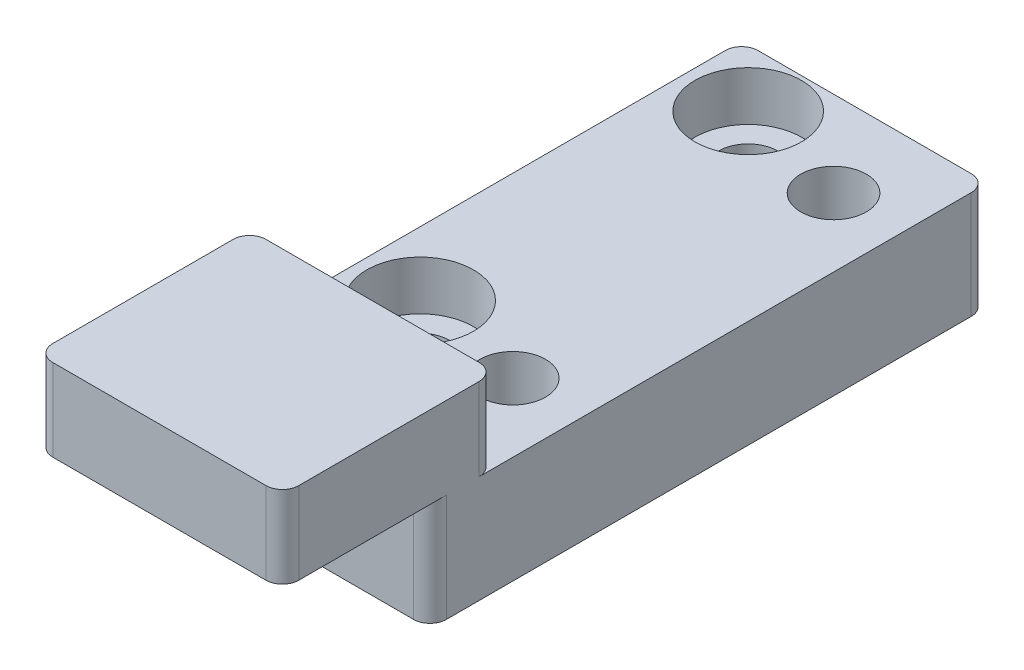
ISO-10303-21;
HEADER;
FILE_DESCRIPTION(('STEP AP214'),'2;1');
FILE_NAME('part.step','',(''),(''),'','','');
FILE_SCHEMA(('AUTOMOTIVE_DESIGN { 1 0 10303 214 1 1 1 1 }'));
ENDSEC;
DATA;
#1=APPLICATION_CONTEXT('core data for automotive mechanical design processes');
#2=APPLICATION_PROTOCOL_DEFINITION('international standard','automotive_design',2000,#1);
#3=PRODUCT_CONTEXT('',#1,'mechanical');
#4=PRODUCT('Part','Part','',(#3));
#5=PRODUCT_RELATED_PRODUCT_CATEGORY('part','',(#4));
#6=PRODUCT_DEFINITION_FORMATION('','',#4);
#7=PRODUCT_DEFINITION_CONTEXT('part definition',#1,'design');
#8=PRODUCT_DEFINITION('design','',#6,#7);
#9=PRODUCT_DEFINITION_SHAPE('','',#8);
#10=(LENGTH_UNIT() NAMED_UNIT(*) SI_UNIT(.MILLI.,.METRE.));
#11=(NAMED_UNIT(*) PLANE_ANGLE_UNIT() SI_UNIT($,.RADIAN.));
#12=(NAMED_UNIT(*) SI_UNIT($,.STERADIAN.) SOLID_ANGLE_UNIT());
#13=UNCERTAINTY_MEASURE_WITH_UNIT(LENGTH_MEASURE(1.E-05),#10,'distance_accuracy_value','');
#14=(GEOMETRIC_REPRESENTATION_CONTEXT(3) GLOBAL_UNCERTAINTY_ASSIGNED_CONTEXT((#13)) GLOBAL_UNIT_ASSIGNED_CONTEXT((#10,
#11,#12)) REPRESENTATION_CONTEXT('',''));
#15=CARTESIAN_POINT('',(0.,0.,0.));
#16=DIRECTION('',(0.,0.,1.));
#17=DIRECTION('',(1.,0.,0.));
#18=AXIS2_PLACEMENT_3D('',#15,#16,#17);
#19=CARTESIAN_POINT('',(0.,0.,30.));
#20=DIRECTION('',(0.,1.,0.));
#21=DIRECTION('',(0.,0.,1.));
#22=AXIS2_PLACEMENT_3D('',#19,#20,#21);
#23=PLANE('',#22);
#24=CARTESIAN_POINT('',(3.89999999997732,0.,3.49999999997199));
#25=DIRECTION('',(0.,1.,0.));
#26=DIRECTION('',(0.,0.,1.));
#27=AXIS2_PLACEMENT_3D('',#24,#25,#26);
#28=CIRCLE('',#27,1.8);
#29=CARTESIAN_POINT('',(3.89999999997732,0.,5.29999999997199));
#30=VERTEX_POINT('',#29);
#31=EDGE_CURVE('E276',#30,#30,#28,.T.);
#32=ORIENTED_EDGE('',*,*,#31,.T.);
#33=EDGE_LOOP('',(#32));
#34=FACE_BOUND('',#33,.T.);
#35=CARTESIAN_POINT('',(3.89999999997738,0.,23.499999999972));
#36=DIRECTION('',(0.,1.,0.));
#37=DIRECTION('',(0.,0.,1.));
#38=AXIS2_PLACEMENT_3D('',#35,#36,#37);
#39=CIRCLE('',#38,1.8);
#40=CARTESIAN_POINT('',(3.89999999997738,0.,25.299999999972));
#41=VERTEX_POINT('',#40);
#42=EDGE_CURVE('E260',#41,#41,#39,.T.);
#43=ORIENTED_EDGE('',*,*,#42,.T.);
#44=EDGE_LOOP('',(#43));
#45=FACE_BOUND('',#44,.T.);
#46=DIRECTION('',(1.,0.,0.));
#47=VECTOR('',#46,1.);
#48=CARTESIAN_POINT('',(0.,0.,0.));
#49=LINE('',#48,#47);
#50=CARTESIAN_POINT('',(1.,0.,0.));
#51=VERTEX_POINT('',#50);
#52=CARTESIAN_POINT('',(14.,0.,0.));
#53=VERTEX_POINT('',#52);
#54=EDGE_CURVE('E256',#51,#53,#49,.T.);
#55=ORIENTED_EDGE('',*,*,#54,.T.);
#56=CARTESIAN_POINT('',(14.,0.,1.));
#57=DIRECTION('',(0.,1.,0.));
#58=DIRECTION('',(0.,0.,1.));
#59=AXIS2_PLACEMENT_3D('',#56,#57,#58);
#60=CIRCLE('',#59,1.);
#61=CARTESIAN_POINT('',(15.,0.,1.));
#62=VERTEX_POINT('',#61);
#63=EDGE_CURVE('E201',#53,#62,#60,.F.);
#64=ORIENTED_EDGE('',*,*,#63,.T.);
#65=DIRECTION('',(0.,0.,-1.));
#66=VECTOR('',#65,1.);
#67=CARTESIAN_POINT('',(15.,0.,30.));
#68=LINE('',#67,#66);
#69=CARTESIAN_POINT('',(15.,0.,33.));
#70=VERTEX_POINT('',#69);
#71=EDGE_CURVE('E167',#70,#62,#68,.T.);
#72=ORIENTED_EDGE('',*,*,#71,.F.);
#73=CARTESIAN_POINT('',(14.,0.,33.));
#74=DIRECTION('',(0.,1.,0.));
#75=DIRECTION('',(0.,0.,1.));
#76=AXIS2_PLACEMENT_3D('',#73,#74,#75);
#77=CIRCLE('',#76,1.);
#78=CARTESIAN_POINT('',(14.,0.,34.));
#79=VERTEX_POINT('',#78);
#80=EDGE_CURVE('E197',#70,#79,#77,.F.);
#81=ORIENTED_EDGE('',*,*,#80,.T.);
#82=DIRECTION('',(1.,0.,0.));
#83=VECTOR('',#82,1.);
#84=CARTESIAN_POINT('',(-17.4023492954256,0.,34.));
#85=LINE('',#84,#83);
#86=CARTESIAN_POINT('',(1.,0.,34.));
#87=VERTEX_POINT('',#86);
#88=EDGE_CURVE('E325',#87,#79,#85,.T.);
#89=ORIENTED_EDGE('',*,*,#88,.F.);
#90=CARTESIAN_POINT('',(1.,0.,33.));
#91=DIRECTION('',(0.,1.,0.));
#92=DIRECTION('',(0.,0.,1.));
#93=AXIS2_PLACEMENT_3D('',#90,#91,#92);
#94=CIRCLE('',#93,1.);
#95=CARTESIAN_POINT('',(0.,0.,33.));
#96=VERTEX_POINT('',#95);
#97=EDGE_CURVE('E195',#87,#96,#94,.F.);
#98=ORIENTED_EDGE('',*,*,#97,.T.);
#99=DIRECTION('',(0.,0.,-1.));
#100=VECTOR('',#99,1.);
#101=CARTESIAN_POINT('',(0.,0.,30.));
#102=LINE('',#101,#100);
#103=CARTESIAN_POINT('',(0.,0.,1.));
#104=VERTEX_POINT('',#103);
#105=EDGE_CURVE('E177',#96,#104,#102,.T.);
#106=ORIENTED_EDGE('',*,*,#105,.T.);
#107=CARTESIAN_POINT('',(1.,0.,1.));
#108=DIRECTION('',(0.,1.,0.));
#109=DIRECTION('',(0.,0.,1.));
#110=AXIS2_PLACEMENT_3D('',#107,#108,#109);
#111=CIRCLE('',#110,1.);
#112=EDGE_CURVE('E199',#104,#51,#111,.F.);
#113=ORIENTED_EDGE('',*,*,#112,.T.);
#114=EDGE_LOOP('',(#55,#64,#72,#81,#89,#98,#106,#113));
#115=FACE_BOUND('',#114,.T.);
#116=CARTESIAN_POINT('',(10.8249999999983,0.,5.22100000000256));
#117=DIRECTION('',(0.,-1.,0.));
#118=DIRECTION('',(0.,0.,-1.));
#119=AXIS2_PLACEMENT_3D('',#116,#117,#118);
#120=CIRCLE('',#119,3.57251);
#121=CARTESIAN_POINT('',(10.8249999999983,0.,1.64849000000256));
#122=VERTEX_POINT('',#121);
#123=EDGE_CURVE('E297',#122,#122,#120,.T.);
#124=ORIENTED_EDGE('',*,*,#123,.F.);
#125=EDGE_LOOP('',(#124));
#126=FACE_BOUND('',#125,.T.);
#127=CARTESIAN_POINT('',(10.8249999999982,0.,24.7790000000026));
#128=DIRECTION('',(0.,-1.,0.));
#129=DIRECTION('',(0.,0.,-1.));
#130=AXIS2_PLACEMENT_3D('',#127,#128,#129);
#131=CIRCLE('',#130,3.57251);
#132=CARTESIAN_POINT('',(10.8249999999982,0.,21.2064900000026));
#133=VERTEX_POINT('',#132);
#134=EDGE_CURVE('E309',#133,#133,#131,.T.);
#135=ORIENTED_EDGE('',*,*,#134,.F.);
#136=EDGE_LOOP('',(#135));
#137=FACE_BOUND('',#136,.T.);
#138=ADVANCED_FACE('F33',(#34,#45,#115,#126,#137),#23,.F.);
#139=CARTESIAN_POINT('',(0.,0.,30.));
#140=DIRECTION('',(1.,0.,0.));
#141=DIRECTION('',(0.,0.,-1.));
#142=AXIS2_PLACEMENT_3D('',#139,#140,#141);
#143=PLANE('',#142);
#144=DIRECTION('',(0.,0.,-1.));
#145=VECTOR('',#144,1.);
#146=CARTESIAN_POINT('',(0.,6.539,30.));
#147=LINE('',#146,#145);
#148=CARTESIAN_POINT('',(0.,6.539,31.));
#149=VERTEX_POINT('',#148);
#150=CARTESIAN_POINT('',(0.,6.539,1.));
#151=VERTEX_POINT('',#150);
#152=EDGE_CURVE('E175',#149,#151,#147,.T.);
#153=ORIENTED_EDGE('',*,*,#152,.T.);
#154=DIRECTION('',(0.,-1.,0.));
#155=VECTOR('',#154,1.);
#156=CARTESIAN_POINT('',(0.,0.,1.));
#157=LINE('',#156,#155);
#158=EDGE_CURVE('E212',#151,#104,#157,.T.);
#159=ORIENTED_EDGE('',*,*,#158,.T.);
#160=ORIENTED_EDGE('',*,*,#105,.F.);
#161=DIRECTION('',(0.,1.,0.));
#162=VECTOR('',#161,1.);
#163=CARTESIAN_POINT('',(0.,6.569,33.));
#164=LINE('',#163,#162);
#165=CARTESIAN_POINT('',(0.,6.569,33.));
#166=VERTEX_POINT('',#165);
#167=EDGE_CURVE('E206',#96,#166,#164,.T.);
#168=ORIENTED_EDGE('',*,*,#167,.T.);
#169=DIRECTION('',(0.,0.,1.));
#170=VECTOR('',#169,1.);
#171=CARTESIAN_POINT('',(0.,6.569,34.));
#172=LINE('',#171,#170);
#173=CARTESIAN_POINT('',(0.,6.569,42.));
#174=VERTEX_POINT('',#173);
#175=EDGE_CURVE('E315',#166,#174,#172,.T.);
#176=ORIENTED_EDGE('',*,*,#175,.T.);
#177=DIRECTION('',(0.,1.,0.));
#178=VECTOR('',#177,1.);
#179=CARTESIAN_POINT('',(0.,11.569,42.));
#180=LINE('',#179,#178);
#181=CARTESIAN_POINT('',(0.,11.569,42.));
#182=VERTEX_POINT('',#181);
#183=EDGE_CURVE('E203',#174,#182,#180,.T.);
#184=ORIENTED_EDGE('',*,*,#183,.T.);
#185=DIRECTION('',(0.,0.,-1.));
#186=VECTOR('',#185,1.);
#187=CARTESIAN_POINT('',(0.,11.569,43.));
#188=LINE('',#187,#186);
#189=CARTESIAN_POINT('',(0.,11.569,31.));
#190=VERTEX_POINT('',#189);
#191=EDGE_CURVE('E312',#182,#190,#188,.T.);
#192=ORIENTED_EDGE('',*,*,#191,.T.);
#193=DIRECTION('',(0.,-1.,0.));
#194=VECTOR('',#193,1.);
#195=CARTESIAN_POINT('',(0.,6.539,31.));
#196=LINE('',#195,#194);
#197=EDGE_CURVE('E209',#190,#149,#196,.T.);
#198=ORIENTED_EDGE('',*,*,#197,.T.);
#199=EDGE_LOOP('',(#153,#159,#160,#168,#176,#184,#192,#198));
#200=FACE_BOUND('',#199,.T.);
#201=ADVANCED_FACE('F334',(#200),#143,.F.);
#202=CARTESIAN_POINT('',(15.,0.,30.));
#203=DIRECTION('',(-1.,0.,0.));
#204=DIRECTION('',(0.,0.,1.));
#205=AXIS2_PLACEMENT_3D('',#202,#203,#204);
#206=PLANE('',#205);
#207=ORIENTED_EDGE('',*,*,#71,.T.);
#208=DIRECTION('',(0.,1.,0.));
#209=VECTOR('',#208,1.);
#210=CARTESIAN_POINT('',(15.,6.539,1.));
#211=LINE('',#210,#209);
#212=CARTESIAN_POINT('',(15.,6.539,1.));
#213=VERTEX_POINT('',#212);
#214=EDGE_CURVE('E150',#62,#213,#211,.T.);
#215=ORIENTED_EDGE('',*,*,#214,.T.);
#216=DIRECTION('',(0.,0.,-1.));
#217=VECTOR('',#216,1.);
#218=CARTESIAN_POINT('',(15.,6.539,30.));
#219=LINE('',#218,#217);
#220=CARTESIAN_POINT('',(15.,6.539,31.));
#221=VERTEX_POINT('',#220);
#222=EDGE_CURVE('E163',#221,#213,#219,.T.);
#223=ORIENTED_EDGE('',*,*,#222,.F.);
#224=DIRECTION('',(0.,1.,0.));
#225=VECTOR('',#224,1.);
#226=CARTESIAN_POINT('',(15.,11.569,31.));
#227=LINE('',#226,#225);
#228=CARTESIAN_POINT('',(15.,11.569,31.));
#229=VERTEX_POINT('',#228);
#230=EDGE_CURVE('E168',#221,#229,#227,.T.);
#231=ORIENTED_EDGE('',*,*,#230,.T.);
#232=DIRECTION('',(0.,0.,1.));
#233=VECTOR('',#232,1.);
#234=CARTESIAN_POINT('',(15.,11.569,43.));
#235=LINE('',#234,#233);
#236=CARTESIAN_POINT('',(15.,11.569,42.));
#237=VERTEX_POINT('',#236);
#238=EDGE_CURVE('E328',#229,#237,#235,.T.);
#239=ORIENTED_EDGE('',*,*,#238,.T.);
#240=DIRECTION('',(0.,-1.,0.));
#241=VECTOR('',#240,1.);
#242=CARTESIAN_POINT('',(15.,6.569,42.));
#243=LINE('',#242,#241);
#244=CARTESIAN_POINT('',(15.,6.569,42.));
#245=VERTEX_POINT('',#244);
#246=EDGE_CURVE('E186',#237,#245,#243,.T.);
#247=ORIENTED_EDGE('',*,*,#246,.T.);
#248=DIRECTION('',(0.,0.,-1.));
#249=VECTOR('',#248,1.);
#250=CARTESIAN_POINT('',(15.,6.569,34.));
#251=LINE('',#250,#249);
#252=CARTESIAN_POINT('',(15.,6.569,33.));
#253=VERTEX_POINT('',#252);
#254=EDGE_CURVE('E244',#245,#253,#251,.T.);
#255=ORIENTED_EDGE('',*,*,#254,.T.);
#256=DIRECTION('',(0.,-1.,0.));
#257=VECTOR('',#256,1.);
#258=CARTESIAN_POINT('',(15.,0.,33.));
#259=LINE('',#258,#257);
#260=EDGE_CURVE('E189',#253,#70,#259,.T.);
#261=ORIENTED_EDGE('',*,*,#260,.T.);
#262=EDGE_LOOP('',(#207,#215,#223,#231,#239,#247,#255,#261));
#263=FACE_BOUND('',#262,.T.);
#264=ADVANCED_FACE('F161',(#263),#206,.F.);
#265=CARTESIAN_POINT('',(0.,6.539,30.));
#266=DIRECTION('',(0.,-1.,0.));
#267=DIRECTION('',(0.,0.,-1.));
#268=AXIS2_PLACEMENT_3D('',#265,#266,#267);
#269=PLANE('',#268);
#270=CARTESIAN_POINT('',(10.8249999999982,6.539,24.7790000000026));
#271=DIRECTION('',(0.,-1.,0.));
#272=DIRECTION('',(0.,0.,-1.));
#273=AXIS2_PLACEMENT_3D('',#270,#271,#272);
#274=CIRCLE('',#273,1.998650054);
#275=CARTESIAN_POINT('',(10.8249999999982,6.539,22.7803499460026));
#276=VERTEX_POINT('',#275);
#277=EDGE_CURVE('E300',#276,#276,#274,.T.);
#278=ORIENTED_EDGE('',*,*,#277,.T.);
#279=EDGE_LOOP('',(#278));
#280=FACE_BOUND('',#279,.T.);
#281=CARTESIAN_POINT('',(10.8249999999983,6.539,5.22100000000256));
#282=DIRECTION('',(0.,-1.,0.));
#283=DIRECTION('',(0.,0.,-1.));
#284=AXIS2_PLACEMENT_3D('',#281,#282,#283);
#285=CIRCLE('',#284,1.998650054);
#286=CARTESIAN_POINT('',(10.8249999999983,6.539,3.22234994600256));
#287=VERTEX_POINT('',#286);
#288=EDGE_CURVE('E288',#287,#287,#285,.T.);
#289=ORIENTED_EDGE('',*,*,#288,.T.);
#290=EDGE_LOOP('',(#289));
#291=FACE_BOUND('',#290,.T.);
#292=CARTESIAN_POINT('',(3.89999999997732,6.539,3.49999999997199));
#293=DIRECTION('',(0.,1.,0.));
#294=DIRECTION('',(0.,0.,1.));
#295=AXIS2_PLACEMENT_3D('',#292,#293,#294);
#296=CIRCLE('',#295,3.25);
#297=CARTESIAN_POINT('',(3.89999999997732,6.539,6.74999999997199));
#298=VERTEX_POINT('',#297);
#299=EDGE_CURVE('E285',#298,#298,#296,.T.);
#300=ORIENTED_EDGE('',*,*,#299,.F.);
#301=EDGE_LOOP('',(#300));
#302=FACE_BOUND('',#301,.T.);
#303=CARTESIAN_POINT('',(3.89999999997738,6.539,23.499999999972));
#304=DIRECTION('',(0.,1.,0.));
#305=DIRECTION('',(0.,0.,1.));
#306=AXIS2_PLACEMENT_3D('',#303,#304,#305);
#307=CIRCLE('',#306,3.25);
#308=CARTESIAN_POINT('',(3.89999999997738,6.539,26.749999999972));
#309=VERTEX_POINT('',#308);
#310=EDGE_CURVE('E273',#309,#309,#307,.T.);
#311=ORIENTED_EDGE('',*,*,#310,.F.);
#312=EDGE_LOOP('',(#311));
#313=FACE_BOUND('',#312,.T.);
#314=ORIENTED_EDGE('',*,*,#222,.T.);
#315=CARTESIAN_POINT('',(14.,6.539,1.));
#316=DIRECTION('',(0.,-1.,0.));
#317=DIRECTION('',(0.,0.,-1.));
#318=AXIS2_PLACEMENT_3D('',#315,#316,#317);
#319=CIRCLE('',#318,1.);
#320=CARTESIAN_POINT('',(14.,6.539,0.));
#321=VERTEX_POINT('',#320);
#322=EDGE_CURVE('E146',#213,#321,#319,.F.);
#323=ORIENTED_EDGE('',*,*,#322,.T.);
#324=DIRECTION('',(-1.,0.,0.));
#325=VECTOR('',#324,1.);
#326=CARTESIAN_POINT('',(0.,6.539,0.));
#327=LINE('',#326,#325);
#328=CARTESIAN_POINT('',(1.,6.539,0.));
#329=VERTEX_POINT('',#328);
#330=EDGE_CURVE('E259',#321,#329,#327,.T.);
#331=ORIENTED_EDGE('',*,*,#330,.T.);
#332=CARTESIAN_POINT('',(1.,6.539,1.));
#333=DIRECTION('',(0.,-1.,0.));
#334=DIRECTION('',(0.,0.,-1.));
#335=AXIS2_PLACEMENT_3D('',#332,#333,#334);
#336=CIRCLE('',#335,1.);
#337=EDGE_CURVE('E157',#329,#151,#336,.F.);
#338=ORIENTED_EDGE('',*,*,#337,.T.);
#339=ORIENTED_EDGE('',*,*,#152,.F.);
#340=CARTESIAN_POINT('',(1.,6.539,31.));
#341=DIRECTION('',(0.,-1.,0.));
#342=DIRECTION('',(0.,0.,-1.));
#343=AXIS2_PLACEMENT_3D('',#340,#341,#342);
#344=CIRCLE('',#343,1.);
#345=CARTESIAN_POINT('',(1.,6.539,30.));
#346=VERTEX_POINT('',#345);
#347=EDGE_CURVE('E237',#149,#346,#344,.T.);
#348=ORIENTED_EDGE('',*,*,#347,.T.);
#349=DIRECTION('',(-1.,0.,0.));
#350=VECTOR('',#349,1.);
#351=CARTESIAN_POINT('',(0.,6.539,30.));
#352=LINE('',#351,#350);
#353=CARTESIAN_POINT('',(14.,6.539,30.));
#354=VERTEX_POINT('',#353);
#355=EDGE_CURVE('E180',#354,#346,#352,.T.);
#356=ORIENTED_EDGE('',*,*,#355,.F.);
#357=CARTESIAN_POINT('',(14.,6.539,31.));
#358=DIRECTION('',(0.,-1.,0.));
#359=DIRECTION('',(0.,0.,-1.));
#360=AXIS2_PLACEMENT_3D('',#357,#358,#359);
#361=CIRCLE('',#360,1.);
#362=EDGE_CURVE('E173',#354,#221,#361,.T.);
#363=ORIENTED_EDGE('',*,*,#362,.T.);
#364=EDGE_LOOP('',(#314,#323,#331,#338,#339,#348,#356,#363));
#365=FACE_BOUND('',#364,.T.);
#366=ADVANCED_FACE('F170',(#280,#291,#302,#313,#365),#269,.F.);
#367=CARTESIAN_POINT('',(0.,0.,0.));
#368=DIRECTION('',(0.,0.,-1.));
#369=DIRECTION('',(-1.,0.,0.));
#370=AXIS2_PLACEMENT_3D('',#367,#368,#369);
#371=PLANE('',#370);
#372=ORIENTED_EDGE('',*,*,#330,.F.);
#373=DIRECTION('',(0.,1.,0.));
#374=VECTOR('',#373,1.);
#375=CARTESIAN_POINT('',(14.,0.,0.));
#376=LINE('',#375,#374);
#377=EDGE_CURVE('E151',#321,#53,#376,.F.);
#378=ORIENTED_EDGE('',*,*,#377,.T.);
#379=ORIENTED_EDGE('',*,*,#54,.F.);
#380=DIRECTION('',(0.,-1.,0.));
#381=VECTOR('',#380,1.);
#382=CARTESIAN_POINT('',(1.,6.539,0.));
#383=LINE('',#382,#381);
#384=EDGE_CURVE('E156',#51,#329,#383,.F.);
#385=ORIENTED_EDGE('',*,*,#384,.T.);
#386=EDGE_LOOP('',(#372,#378,#379,#385));
#387=FACE_BOUND('',#386,.T.);
#388=ADVANCED_FACE('F366',(#387),#371,.T.);
#389=CARTESIAN_POINT('',(3.89999999997738,6.539,23.499999999972));
#390=DIRECTION('',(0.,1.,0.));
#391=DIRECTION('',(0.,0.,1.));
#392=AXIS2_PLACEMENT_3D('',#389,#390,#391);
#393=CYLINDRICAL_SURFACE('',#392,1.8);
#394=ORIENTED_EDGE('',*,*,#42,.F.);
#395=EDGE_LOOP('',(#394));
#396=FACE_BOUND('',#395,.T.);
#397=CARTESIAN_POINT('',(3.89999999997738,3.539,23.499999999972));
#398=DIRECTION('',(0.,1.,0.));
#399=DIRECTION('',(0.,0.,1.));
#400=AXIS2_PLACEMENT_3D('',#397,#398,#399);
#401=CIRCLE('',#400,1.8);
#402=CARTESIAN_POINT('',(3.89999999997738,3.539,25.299999999972));
#403=VERTEX_POINT('',#402);
#404=EDGE_CURVE('E263',#403,#403,#401,.T.);
#405=ORIENTED_EDGE('',*,*,#404,.T.);
#406=EDGE_LOOP('',(#405));
#407=FACE_BOUND('',#406,.T.);
#408=ADVANCED_FACE('F368',(#396,#407),#393,.F.);
#409=CARTESIAN_POINT('',(5.69999999997738,3.539,23.499999999972));
#410=DIRECTION('',(0.,-1.,0.));
#411=DIRECTION('',(0.,0.,-1.));
#412=AXIS2_PLACEMENT_3D('',#409,#410,#411);
#413=PLANE('',#412);
#414=ORIENTED_EDGE('',*,*,#404,.F.);
#415=EDGE_LOOP('',(#414));
#416=FACE_BOUND('',#415,.T.);
#417=CARTESIAN_POINT('',(3.89999999997738,3.539,23.499999999972));
#418=DIRECTION('',(0.,1.,0.));
#419=DIRECTION('',(0.,0.,1.));
#420=AXIS2_PLACEMENT_3D('',#417,#418,#419);
#421=CIRCLE('',#420,3.25);
#422=CARTESIAN_POINT('',(3.89999999997738,3.539,26.749999999972));
#423=VERTEX_POINT('',#422);
#424=EDGE_CURVE('E270',#423,#423,#421,.T.);
#425=ORIENTED_EDGE('',*,*,#424,.T.);
#426=EDGE_LOOP('',(#425));
#427=FACE_BOUND('',#426,.T.);
#428=ADVANCED_FACE('F374',(#416,#427),#413,.F.);
#429=CARTESIAN_POINT('',(3.89999999997738,6.539,23.499999999972));
#430=DIRECTION('',(0.,1.,0.));
#431=DIRECTION('',(0.,0.,1.));
#432=AXIS2_PLACEMENT_3D('',#429,#430,#431);
#433=CYLINDRICAL_SURFACE('',#432,3.25);
#434=ORIENTED_EDGE('',*,*,#424,.F.);
#435=EDGE_LOOP('',(#434));
#436=FACE_BOUND('',#435,.T.);
#437=ORIENTED_EDGE('',*,*,#310,.T.);
#438=EDGE_LOOP('',(#437));
#439=FACE_BOUND('',#438,.T.);
#440=ADVANCED_FACE('F611',(#436,#439),#433,.F.);
#441=CARTESIAN_POINT('',(3.89999999997732,6.539,3.49999999997199));
#442=DIRECTION('',(0.,1.,0.));
#443=DIRECTION('',(0.,0.,1.));
#444=AXIS2_PLACEMENT_3D('',#441,#442,#443);
#445=CYLINDRICAL_SURFACE('',#444,1.8);
#446=ORIENTED_EDGE('',*,*,#31,.F.);
#447=EDGE_LOOP('',(#446));
#448=FACE_BOUND('',#447,.T.);
#449=CARTESIAN_POINT('',(3.89999999997732,3.539,3.49999999997199));
#450=DIRECTION('',(0.,1.,0.));
#451=DIRECTION('',(0.,0.,1.));
#452=AXIS2_PLACEMENT_3D('',#449,#450,#451);
#453=CIRCLE('',#452,1.8);
#454=CARTESIAN_POINT('',(3.89999999997732,3.539,5.29999999997199));
#455=VERTEX_POINT('',#454);
#456=EDGE_CURVE('E279',#455,#455,#453,.T.);
#457=ORIENTED_EDGE('',*,*,#456,.T.);
#458=EDGE_LOOP('',(#457));
#459=FACE_BOUND('',#458,.T.);
#460=ADVANCED_FACE('F601',(#448,#459),#445,.F.);
#461=CARTESIAN_POINT('',(5.69999999997732,3.539,3.49999999997199));
#462=DIRECTION('',(0.,-1.,0.));
#463=DIRECTION('',(0.,0.,-1.));
#464=AXIS2_PLACEMENT_3D('',#461,#462,#463);
#465=PLANE('',#464);
#466=ORIENTED_EDGE('',*,*,#456,.F.);
#467=EDGE_LOOP('',(#466));
#468=FACE_BOUND('',#467,.T.);
#469=CARTESIAN_POINT('',(3.89999999997732,3.539,3.49999999997199));
#470=DIRECTION('',(0.,1.,0.));
#471=DIRECTION('',(0.,0.,1.));
#472=AXIS2_PLACEMENT_3D('',#469,#470,#471);
#473=CIRCLE('',#472,3.25);
#474=CARTESIAN_POINT('',(3.89999999997732,3.539,6.74999999997199));
#475=VERTEX_POINT('',#474);
#476=EDGE_CURVE('E282',#475,#475,#473,.T.);
#477=ORIENTED_EDGE('',*,*,#476,.T.);
#478=EDGE_LOOP('',(#477));
#479=FACE_BOUND('',#478,.T.);
#480=ADVANCED_FACE('F591',(#468,#479),#465,.F.);
#481=CARTESIAN_POINT('',(3.89999999997732,6.539,3.49999999997199));
#482=DIRECTION('',(0.,1.,0.));
#483=DIRECTION('',(0.,0.,1.));
#484=AXIS2_PLACEMENT_3D('',#481,#482,#483);
#485=CYLINDRICAL_SURFACE('',#484,3.25);
#486=ORIENTED_EDGE('',*,*,#476,.F.);
#487=EDGE_LOOP('',(#486));
#488=FACE_BOUND('',#487,.T.);
#489=ORIENTED_EDGE('',*,*,#299,.T.);
#490=EDGE_LOOP('',(#489));
#491=FACE_BOUND('',#490,.T.);
#492=ADVANCED_FACE('F581',(#488,#491),#485,.F.);
#493=CARTESIAN_POINT('',(10.8249999999983,0.,5.22100000000256));
#494=DIRECTION('',(0.,-1.,0.));
#495=DIRECTION('',(0.,0.,-1.));
#496=AXIS2_PLACEMENT_3D('',#493,#494,#495);
#497=CYLINDRICAL_SURFACE('',#496,1.998650054);
#498=ORIENTED_EDGE('',*,*,#288,.F.);
#499=EDGE_LOOP('',(#498));
#500=FACE_BOUND('',#499,.T.);
#501=CARTESIAN_POINT('',(10.8249999999983,3.5052,5.22100000000256));
#502=DIRECTION('',(0.,-1.,0.));
#503=DIRECTION('',(0.,0.,-1.));
#504=AXIS2_PLACEMENT_3D('',#501,#502,#503);
#505=CIRCLE('',#504,1.998650054);
#506=CARTESIAN_POINT('',(10.8249999999983,3.5052,3.22234994600256));
#507=VERTEX_POINT('',#506);
#508=EDGE_CURVE('E291',#507,#507,#505,.T.);
#509=ORIENTED_EDGE('',*,*,#508,.T.);
#510=EDGE_LOOP('',(#509));
#511=FACE_BOUND('',#510,.T.);
#512=ADVANCED_FACE('F571',(#500,#511),#497,.F.);
#513=CARTESIAN_POINT('',(12.8236500539983,3.5052,5.22100000000256));
#514=DIRECTION('',(0.,1.,0.));
#515=DIRECTION('',(0.,0.,1.));
#516=AXIS2_PLACEMENT_3D('',#513,#514,#515);
#517=PLANE('',#516);
#518=ORIENTED_EDGE('',*,*,#508,.F.);
#519=EDGE_LOOP('',(#518));
#520=FACE_BOUND('',#519,.T.);
#521=CARTESIAN_POINT('',(10.8249999999983,3.5052,5.22100000000256));
#522=DIRECTION('',(0.,-1.,0.));
#523=DIRECTION('',(0.,0.,-1.));
#524=AXIS2_PLACEMENT_3D('',#521,#522,#523);
#525=CIRCLE('',#524,3.57251);
#526=CARTESIAN_POINT('',(10.8249999999983,3.5052,1.64849000000256));
#527=VERTEX_POINT('',#526);
#528=EDGE_CURVE('E294',#527,#527,#525,.T.);
#529=ORIENTED_EDGE('',*,*,#528,.T.);
#530=EDGE_LOOP('',(#529));
#531=FACE_BOUND('',#530,.T.);
#532=ADVANCED_FACE('F561',(#520,#531),#517,.F.);
#533=CARTESIAN_POINT('',(10.8249999999983,0.,5.22100000000256));
#534=DIRECTION('',(0.,-1.,0.));
#535=DIRECTION('',(0.,0.,-1.));
#536=AXIS2_PLACEMENT_3D('',#533,#534,#535);
#537=CYLINDRICAL_SURFACE('',#536,3.57251);
#538=ORIENTED_EDGE('',*,*,#528,.F.);
#539=EDGE_LOOP('',(#538));
#540=FACE_BOUND('',#539,.T.);
#541=ORIENTED_EDGE('',*,*,#123,.T.);
#542=EDGE_LOOP('',(#541));
#543=FACE_BOUND('',#542,.T.);
#544=ADVANCED_FACE('F551',(#540,#543),#537,.F.);
#545=CARTESIAN_POINT('',(10.8249999999982,0.,24.7790000000026));
#546=DIRECTION('',(0.,-1.,0.));
#547=DIRECTION('',(0.,0.,-1.));
#548=AXIS2_PLACEMENT_3D('',#545,#546,#547);
#549=CYLINDRICAL_SURFACE('',#548,1.998650054);
#550=ORIENTED_EDGE('',*,*,#277,.F.);
#551=EDGE_LOOP('',(#550));
#552=FACE_BOUND('',#551,.T.);
#553=CARTESIAN_POINT('',(10.8249999999982,3.5052,24.7790000000026));
#554=DIRECTION('',(0.,-1.,0.));
#555=DIRECTION('',(0.,0.,-1.));
#556=AXIS2_PLACEMENT_3D('',#553,#554,#555);
#557=CIRCLE('',#556,1.998650054);
#558=CARTESIAN_POINT('',(10.8249999999982,3.5052,22.7803499460026));
#559=VERTEX_POINT('',#558);
#560=EDGE_CURVE('E303',#559,#559,#557,.T.);
#561=ORIENTED_EDGE('',*,*,#560,.T.);
#562=EDGE_LOOP('',(#561));
#563=FACE_BOUND('',#562,.T.);
#564=ADVANCED_FACE('F541',(#552,#563),#549,.F.);
#565=CARTESIAN_POINT('',(12.8236500539982,3.5052,24.7790000000026));
#566=DIRECTION('',(0.,1.,0.));
#567=DIRECTION('',(0.,0.,1.));
#568=AXIS2_PLACEMENT_3D('',#565,#566,#567);
#569=PLANE('',#568);
#570=ORIENTED_EDGE('',*,*,#560,.F.);
#571=EDGE_LOOP('',(#570));
#572=FACE_BOUND('',#571,.T.);
#573=CARTESIAN_POINT('',(10.8249999999982,3.5052,24.7790000000026));
#574=DIRECTION('',(0.,-1.,0.));
#575=DIRECTION('',(0.,0.,-1.));
#576=AXIS2_PLACEMENT_3D('',#573,#574,#575);
#577=CIRCLE('',#576,3.57251);
#578=CARTESIAN_POINT('',(10.8249999999982,3.5052,21.2064900000026));
#579=VERTEX_POINT('',#578);
#580=EDGE_CURVE('E306',#579,#579,#577,.T.);
#581=ORIENTED_EDGE('',*,*,#580,.T.);
#582=EDGE_LOOP('',(#581));
#583=FACE_BOUND('',#582,.T.);
#584=ADVANCED_FACE('F531',(#572,#583),#569,.F.);
#585=CARTESIAN_POINT('',(10.8249999999982,0.,24.7790000000026));
#586=DIRECTION('',(0.,-1.,0.));
#587=DIRECTION('',(0.,0.,-1.));
#588=AXIS2_PLACEMENT_3D('',#585,#586,#587);
#589=CYLINDRICAL_SURFACE('',#588,3.57251);
#590=ORIENTED_EDGE('',*,*,#580,.F.);
#591=EDGE_LOOP('',(#590));
#592=FACE_BOUND('',#591,.T.);
#593=ORIENTED_EDGE('',*,*,#134,.T.);
#594=EDGE_LOOP('',(#593));
#595=FACE_BOUND('',#594,.T.);
#596=ADVANCED_FACE('F490',(#592,#595),#589,.F.);
#597=CARTESIAN_POINT('',(-17.4023492954256,11.569,30.));
#598=DIRECTION('',(0.,0.,-1.));
#599=DIRECTION('',(-1.,0.,0.));
#600=AXIS2_PLACEMENT_3D('',#597,#598,#599);
#601=PLANE('',#600);
#602=ORIENTED_EDGE('',*,*,#355,.T.);
#603=DIRECTION('',(0.,-1.,0.));
#604=VECTOR('',#603,1.);
#605=CARTESIAN_POINT('',(1.,11.569,30.));
#606=LINE('',#605,#604);
#607=CARTESIAN_POINT('',(1.,11.569,30.));
#608=VERTEX_POINT('',#607);
#609=EDGE_CURVE('E217',#346,#608,#606,.F.);
#610=ORIENTED_EDGE('',*,*,#609,.T.);
#611=DIRECTION('',(1.,0.,0.));
#612=VECTOR('',#611,1.);
#613=CARTESIAN_POINT('',(-17.4023492954256,11.569,30.));
#614=LINE('',#613,#612);
#615=CARTESIAN_POINT('',(14.,11.569,30.));
#616=VERTEX_POINT('',#615);
#617=EDGE_CURVE('E316',#608,#616,#614,.T.);
#618=ORIENTED_EDGE('',*,*,#617,.T.);
#619=DIRECTION('',(0.,1.,0.));
#620=VECTOR('',#619,1.);
#621=CARTESIAN_POINT('',(14.,6.539,30.));
#622=LINE('',#621,#620);
#623=EDGE_CURVE('E215',#616,#354,#622,.F.);
#624=ORIENTED_EDGE('',*,*,#623,.T.);
#625=EDGE_LOOP('',(#602,#610,#618,#624));
#626=FACE_BOUND('',#625,.T.);
#627=ADVANCED_FACE('F356',(#626),#601,.T.);
#628=CARTESIAN_POINT('',(-17.4023492954256,0.,34.));
#629=DIRECTION('',(0.,0.,1.));
#630=DIRECTION('',(1.,0.,0.));
#631=AXIS2_PLACEMENT_3D('',#628,#629,#630);
#632=PLANE('',#631);
#633=ORIENTED_EDGE('',*,*,#88,.T.);
#634=DIRECTION('',(0.,-1.,0.));
#635=VECTOR('',#634,1.);
#636=CARTESIAN_POINT('',(14.,6.569,34.));
#637=LINE('',#636,#635);
#638=CARTESIAN_POINT('',(14.,6.569,34.));
#639=VERTEX_POINT('',#638);
#640=EDGE_CURVE('E229',#79,#639,#637,.F.);
#641=ORIENTED_EDGE('',*,*,#640,.T.);
#642=DIRECTION('',(1.,0.,0.));
#643=VECTOR('',#642,1.);
#644=CARTESIAN_POINT('',(-17.4023492954256,6.569,34.));
#645=LINE('',#644,#643);
#646=CARTESIAN_POINT('',(1.,6.569,34.));
#647=VERTEX_POINT('',#646);
#648=EDGE_CURVE('E246',#647,#639,#645,.T.);
#649=ORIENTED_EDGE('',*,*,#648,.F.);
#650=DIRECTION('',(0.,1.,0.));
#651=VECTOR('',#650,1.);
#652=CARTESIAN_POINT('',(1.,0.,34.));
#653=LINE('',#652,#651);
#654=EDGE_CURVE('E227',#647,#87,#653,.F.);
#655=ORIENTED_EDGE('',*,*,#654,.T.);
#656=EDGE_LOOP('',(#633,#641,#649,#655));
#657=FACE_BOUND('',#656,.T.);
#658=ADVANCED_FACE('F473',(#657),#632,.T.);
#659=CARTESIAN_POINT('',(-17.4023492954256,6.569,34.));
#660=DIRECTION('',(0.,-1.,0.));
#661=DIRECTION('',(0.,0.,-1.));
#662=AXIS2_PLACEMENT_3D('',#659,#660,#661);
#663=PLANE('',#662);
#664=DIRECTION('',(1.,0.,0.));
#665=VECTOR('',#664,1.);
#666=CARTESIAN_POINT('',(-17.4023492954256,6.569,43.));
#667=LINE('',#666,#665);
#668=CARTESIAN_POINT('',(1.,6.569,43.));
#669=VERTEX_POINT('',#668);
#670=CARTESIAN_POINT('',(14.,6.569,43.));
#671=VERTEX_POINT('',#670);
#672=EDGE_CURVE('E322',#669,#671,#667,.T.);
#673=ORIENTED_EDGE('',*,*,#672,.F.);
#674=CARTESIAN_POINT('',(1.,6.569,42.));
#675=DIRECTION('',(0.,-1.,0.));
#676=DIRECTION('',(0.,0.,-1.));
#677=AXIS2_PLACEMENT_3D('',#674,#675,#676);
#678=CIRCLE('',#677,1.);
#679=EDGE_CURVE('E235',#669,#174,#678,.T.);
#680=ORIENTED_EDGE('',*,*,#679,.T.);
#681=ORIENTED_EDGE('',*,*,#175,.F.);
#682=CARTESIAN_POINT('',(1.,6.569,33.));
#683=DIRECTION('',(0.,-1.,0.));
#684=DIRECTION('',(0.,0.,-1.));
#685=AXIS2_PLACEMENT_3D('',#682,#683,#684);
#686=CIRCLE('',#685,1.);
#687=EDGE_CURVE('E11',#166,#647,#686,.F.);
#688=ORIENTED_EDGE('',*,*,#687,.T.);
#689=ORIENTED_EDGE('',*,*,#648,.T.);
#690=CARTESIAN_POINT('',(14.,6.569,33.));
#691=DIRECTION('',(0.,-1.,0.));
#692=DIRECTION('',(0.,0.,-1.));
#693=AXIS2_PLACEMENT_3D('',#690,#691,#692);
#694=CIRCLE('',#693,1.);
#695=EDGE_CURVE('E41',#639,#253,#694,.F.);
#696=ORIENTED_EDGE('',*,*,#695,.T.);
#697=ORIENTED_EDGE('',*,*,#254,.F.);
#698=CARTESIAN_POINT('',(14.,6.569,42.));
#699=DIRECTION('',(0.,-1.,0.));
#700=DIRECTION('',(0.,0.,-1.));
#701=AXIS2_PLACEMENT_3D('',#698,#699,#700);
#702=CIRCLE('',#701,1.);
#703=EDGE_CURVE('E48',#245,#671,#702,.T.);
#704=ORIENTED_EDGE('',*,*,#703,.T.);
#705=EDGE_LOOP('',(#673,#680,#681,#688,#689,#696,#697,#704));
#706=FACE_BOUND('',#705,.T.);
#707=ADVANCED_FACE('F243',(#706),#663,.T.);
#708=CARTESIAN_POINT('',(-17.4023492954256,6.569,43.));
#709=DIRECTION('',(0.,0.,1.));
#710=DIRECTION('',(1.,0.,0.));
#711=AXIS2_PLACEMENT_3D('',#708,#709,#710);
#712=PLANE('',#711);
#713=DIRECTION('',(1.,0.,0.));
#714=VECTOR('',#713,1.);
#715=CARTESIAN_POINT('',(-17.4023492954256,11.569,43.));
#716=LINE('',#715,#714);
#717=CARTESIAN_POINT('',(1.,11.569,43.));
#718=VERTEX_POINT('',#717);
#719=CARTESIAN_POINT('',(14.,11.569,43.));
#720=VERTEX_POINT('',#719);
#721=EDGE_CURVE('E319',#718,#720,#716,.T.);
#722=ORIENTED_EDGE('',*,*,#721,.F.);
#723=DIRECTION('',(0.,1.,0.));
#724=VECTOR('',#723,1.);
#725=CARTESIAN_POINT('',(1.,6.569,43.));
#726=LINE('',#725,#724);
#727=EDGE_CURVE('E55',#718,#669,#726,.F.);
#728=ORIENTED_EDGE('',*,*,#727,.T.);
#729=ORIENTED_EDGE('',*,*,#672,.T.);
#730=DIRECTION('',(0.,-1.,0.));
#731=VECTOR('',#730,1.);
#732=CARTESIAN_POINT('',(14.,11.569,43.));
#733=LINE('',#732,#731);
#734=EDGE_CURVE('E231',#671,#720,#733,.F.);
#735=ORIENTED_EDGE('',*,*,#734,.T.);
#736=EDGE_LOOP('',(#722,#728,#729,#735));
#737=FACE_BOUND('',#736,.T.);
#738=ADVANCED_FACE('F346',(#737),#712,.T.);
#739=CARTESIAN_POINT('',(-17.4023492954256,11.569,43.));
#740=DIRECTION('',(0.,1.,0.));
#741=DIRECTION('',(0.,0.,1.));
#742=AXIS2_PLACEMENT_3D('',#739,#740,#741);
#743=PLANE('',#742);
#744=ORIENTED_EDGE('',*,*,#617,.F.);
#745=CARTESIAN_POINT('',(1.,11.569,31.));
#746=DIRECTION('',(0.,1.,0.));
#747=DIRECTION('',(0.,0.,1.));
#748=AXIS2_PLACEMENT_3D('',#745,#746,#747);
#749=CIRCLE('',#748,1.);
#750=EDGE_CURVE('E225',#608,#190,#749,.T.);
#751=ORIENTED_EDGE('',*,*,#750,.T.);
#752=ORIENTED_EDGE('',*,*,#191,.F.);
#753=CARTESIAN_POINT('',(1.,11.569,42.));
#754=DIRECTION('',(0.,1.,0.));
#755=DIRECTION('',(0.,0.,1.));
#756=AXIS2_PLACEMENT_3D('',#753,#754,#755);
#757=CIRCLE('',#756,1.);
#758=EDGE_CURVE('E221',#182,#718,#757,.T.);
#759=ORIENTED_EDGE('',*,*,#758,.T.);
#760=ORIENTED_EDGE('',*,*,#721,.T.);
#761=CARTESIAN_POINT('',(14.,11.569,42.));
#762=DIRECTION('',(0.,1.,0.));
#763=DIRECTION('',(0.,0.,1.));
#764=AXIS2_PLACEMENT_3D('',#761,#762,#763);
#765=CIRCLE('',#764,1.);
#766=EDGE_CURVE('E219',#720,#237,#765,.T.);
#767=ORIENTED_EDGE('',*,*,#766,.T.);
#768=ORIENTED_EDGE('',*,*,#238,.F.);
#769=CARTESIAN_POINT('',(14.,11.569,31.));
#770=DIRECTION('',(0.,1.,0.));
#771=DIRECTION('',(0.,0.,1.));
#772=AXIS2_PLACEMENT_3D('',#769,#770,#771);
#773=CIRCLE('',#772,1.);
#774=EDGE_CURVE('E223',#229,#616,#773,.T.);
#775=ORIENTED_EDGE('',*,*,#774,.T.);
#776=EDGE_LOOP('',(#744,#751,#752,#759,#760,#767,#768,#775));
#777=FACE_BOUND('',#776,.T.);
#778=ADVANCED_FACE('F344',(#777),#743,.T.);
#779=CARTESIAN_POINT('',(14.,0.,1.));
#780=DIRECTION('',(0.,-1.,0.));
#781=DIRECTION('',(0.,0.,-1.));
#782=AXIS2_PLACEMENT_3D('',#779,#780,#781);
#783=CYLINDRICAL_SURFACE('',#782,1.);
#784=ORIENTED_EDGE('',*,*,#63,.F.);
#785=ORIENTED_EDGE('',*,*,#377,.F.);
#786=ORIENTED_EDGE('',*,*,#322,.F.);
#787=ORIENTED_EDGE('',*,*,#214,.F.);
#788=EDGE_LOOP('',(#784,#785,#786,#787));
#789=FACE_BOUND('',#788,.T.);
#790=ADVANCED_FACE('F149',(#789),#783,.T.);
#791=CARTESIAN_POINT('',(1.,0.,1.));
#792=DIRECTION('',(0.,1.,0.));
#793=DIRECTION('',(0.,0.,1.));
#794=AXIS2_PLACEMENT_3D('',#791,#792,#793);
#795=CYLINDRICAL_SURFACE('',#794,1.);
#796=ORIENTED_EDGE('',*,*,#337,.F.);
#797=ORIENTED_EDGE('',*,*,#384,.F.);
#798=ORIENTED_EDGE('',*,*,#112,.F.);
#799=ORIENTED_EDGE('',*,*,#158,.F.);
#800=EDGE_LOOP('',(#796,#797,#798,#799));
#801=FACE_BOUND('',#800,.T.);
#802=ADVANCED_FACE('F365',(#801),#795,.T.);
#803=CARTESIAN_POINT('',(1.,0.,31.));
#804=DIRECTION('',(0.,1.,0.));
#805=DIRECTION('',(0.,0.,1.));
#806=AXIS2_PLACEMENT_3D('',#803,#804,#805);
#807=CYLINDRICAL_SURFACE('',#806,1.);
#808=ORIENTED_EDGE('',*,*,#750,.F.);
#809=ORIENTED_EDGE('',*,*,#609,.F.);
#810=ORIENTED_EDGE('',*,*,#347,.F.);
#811=ORIENTED_EDGE('',*,*,#197,.F.);
#812=EDGE_LOOP('',(#808,#809,#810,#811));
#813=FACE_BOUND('',#812,.T.);
#814=ADVANCED_FACE('F360',(#813),#807,.T.);
#815=CARTESIAN_POINT('',(14.,0.,31.));
#816=DIRECTION('',(0.,-1.,0.));
#817=DIRECTION('',(0.,0.,-1.));
#818=AXIS2_PLACEMENT_3D('',#815,#816,#817);
#819=CYLINDRICAL_SURFACE('',#818,1.);
#820=ORIENTED_EDGE('',*,*,#362,.F.);
#821=ORIENTED_EDGE('',*,*,#623,.F.);
#822=ORIENTED_EDGE('',*,*,#774,.F.);
#823=ORIENTED_EDGE('',*,*,#230,.F.);
#824=EDGE_LOOP('',(#820,#821,#822,#823));
#825=FACE_BOUND('',#824,.T.);
#826=ADVANCED_FACE('F352',(#825),#819,.T.);
#827=CARTESIAN_POINT('',(14.,0.,33.));
#828=DIRECTION('',(0.,1.,0.));
#829=DIRECTION('',(0.,0.,1.));
#830=AXIS2_PLACEMENT_3D('',#827,#828,#829);
#831=CYLINDRICAL_SURFACE('',#830,1.);
#832=ORIENTED_EDGE('',*,*,#695,.F.);
#833=ORIENTED_EDGE('',*,*,#640,.F.);
#834=ORIENTED_EDGE('',*,*,#80,.F.);
#835=ORIENTED_EDGE('',*,*,#260,.F.);
#836=EDGE_LOOP('',(#832,#833,#834,#835));
#837=FACE_BOUND('',#836,.T.);
#838=ADVANCED_FACE('F249',(#837),#831,.T.);
#839=CARTESIAN_POINT('',(1.,0.,33.));
#840=DIRECTION('',(0.,-1.,0.));
#841=DIRECTION('',(0.,0.,-1.));
#842=AXIS2_PLACEMENT_3D('',#839,#840,#841);
#843=CYLINDRICAL_SURFACE('',#842,1.);
#844=ORIENTED_EDGE('',*,*,#97,.F.);
#845=ORIENTED_EDGE('',*,*,#654,.F.);
#846=ORIENTED_EDGE('',*,*,#687,.F.);
#847=ORIENTED_EDGE('',*,*,#167,.F.);
#848=EDGE_LOOP('',(#844,#845,#846,#847));
#849=FACE_BOUND('',#848,.T.);
#850=ADVANCED_FACE('F399',(#849),#843,.T.);
#851=CARTESIAN_POINT('',(1.,0.,42.));
#852=DIRECTION('',(0.,-1.,0.));
#853=DIRECTION('',(0.,0.,-1.));
#854=AXIS2_PLACEMENT_3D('',#851,#852,#853);
#855=CYLINDRICAL_SURFACE('',#854,1.);
#856=ORIENTED_EDGE('',*,*,#679,.F.);
#857=ORIENTED_EDGE('',*,*,#727,.F.);
#858=ORIENTED_EDGE('',*,*,#758,.F.);
#859=ORIENTED_EDGE('',*,*,#183,.F.);
#860=EDGE_LOOP('',(#856,#857,#858,#859));
#861=FACE_BOUND('',#860,.T.);
#862=ADVANCED_FACE('F341',(#861),#855,.T.);
#863=CARTESIAN_POINT('',(14.,0.,42.));
#864=DIRECTION('',(0.,1.,0.));
#865=DIRECTION('',(0.,0.,1.));
#866=AXIS2_PLACEMENT_3D('',#863,#864,#865);
#867=CYLINDRICAL_SURFACE('',#866,1.);
#868=ORIENTED_EDGE('',*,*,#766,.F.);
#869=ORIENTED_EDGE('',*,*,#734,.F.);
#870=ORIENTED_EDGE('',*,*,#703,.F.);
#871=ORIENTED_EDGE('',*,*,#246,.F.);
#872=EDGE_LOOP('',(#868,#869,#870,#871));
#873=FACE_BOUND('',#872,.T.);
#874=ADVANCED_FACE('F35',(#873),#867,.T.);
#875=CLOSED_SHELL('',(#138,#201,#264,#366,#388,#408,#428,#440,#460,#480,#492,#512,#532,#544,
#564,#584,#596,#627,#658,#707,#738,#778,#790,#802,#814,#826,#838,#850,#862,#874));
#876=MANIFOLD_SOLID_BREP('B2',#875);
#877=ADVANCED_BREP_SHAPE_REPRESENTATION('',(#18,#876),#14);
#878=SHAPE_DEFINITION_REPRESENTATION(#9,#877);
ENDSEC;
END-ISO-10303-21;
